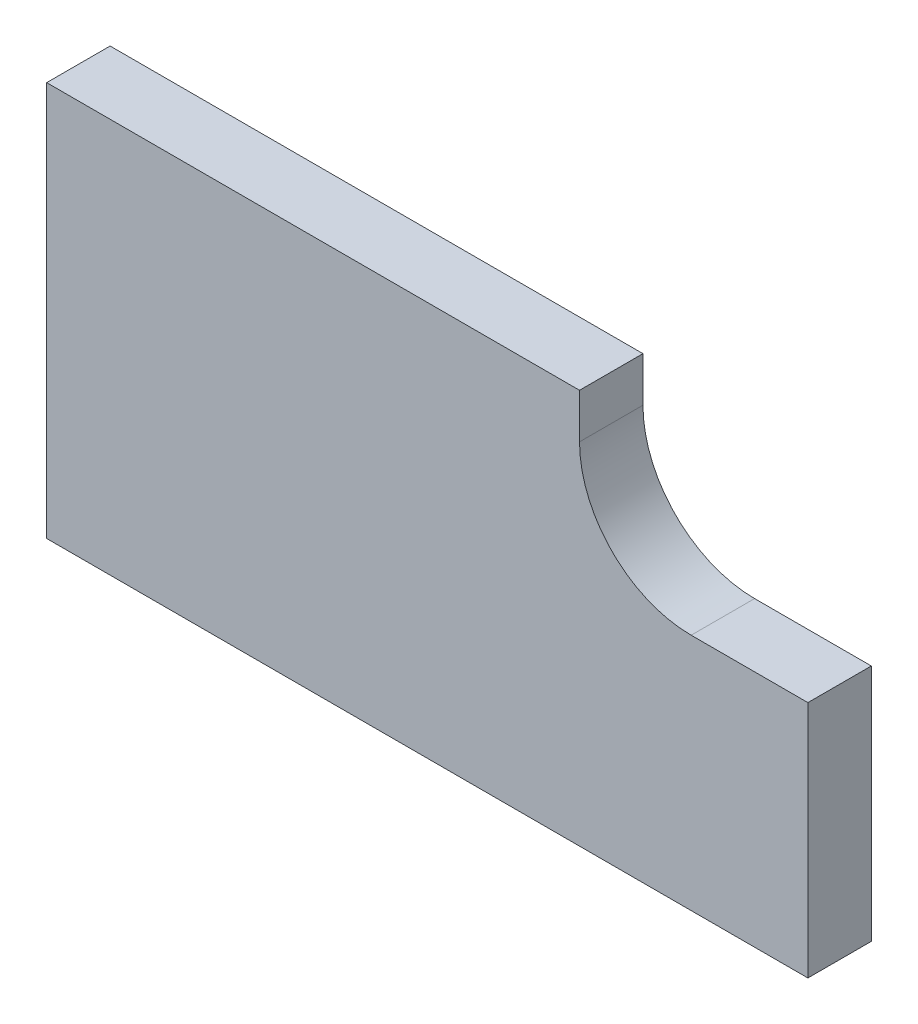
ISO-10303-21;
HEADER;
FILE_DESCRIPTION(('STEP AP214'),'2;1');
FILE_NAME('part.step','',(''),(''),'','','');
FILE_SCHEMA(('AUTOMOTIVE_DESIGN { 1 0 10303 214 1 1 1 1 }'));
ENDSEC;
DATA;
#1=APPLICATION_CONTEXT('core data for automotive mechanical design processes');
#2=APPLICATION_PROTOCOL_DEFINITION('international standard','automotive_design',2000,#1);
#3=PRODUCT_CONTEXT('',#1,'mechanical');
#4=PRODUCT('Part','Part','',(#3));
#5=PRODUCT_RELATED_PRODUCT_CATEGORY('part','',(#4));
#6=PRODUCT_DEFINITION_FORMATION('','',#4);
#7=PRODUCT_DEFINITION_CONTEXT('part definition',#1,'design');
#8=PRODUCT_DEFINITION('design','',#6,#7);
#9=PRODUCT_DEFINITION_SHAPE('','',#8);
#10=(LENGTH_UNIT() NAMED_UNIT(*) SI_UNIT(.MILLI.,.METRE.));
#11=(NAMED_UNIT(*) PLANE_ANGLE_UNIT() SI_UNIT($,.RADIAN.));
#12=(NAMED_UNIT(*) SI_UNIT($,.STERADIAN.) SOLID_ANGLE_UNIT());
#13=UNCERTAINTY_MEASURE_WITH_UNIT(LENGTH_MEASURE(1.E-05),#10,'distance_accuracy_value','');
#14=(GEOMETRIC_REPRESENTATION_CONTEXT(3) GLOBAL_UNCERTAINTY_ASSIGNED_CONTEXT((#13)) GLOBAL_UNIT_ASSIGNED_CONTEXT((#10,
#11,#12)) REPRESENTATION_CONTEXT('',''));
#15=CARTESIAN_POINT('',(0.,0.,0.));
#16=DIRECTION('',(0.,0.,1.));
#17=DIRECTION('',(1.,0.,0.));
#18=AXIS2_PLACEMENT_3D('',#15,#16,#17);
#19=CARTESIAN_POINT('',(0.,0.,5.5));
#20=DIRECTION('',(1.,0.,0.));
#21=DIRECTION('',(0.,0.,-1.));
#22=AXIS2_PLACEMENT_3D('',#19,#20,#21);
#23=PLANE('',#22);
#24=DIRECTION('',(0.,-1.,0.));
#25=VECTOR('',#24,1.);
#26=CARTESIAN_POINT('',(0.,92.,12.5));
#27=LINE('',#26,#25);
#28=CARTESIAN_POINT('',(0.,77.8,12.5));
#29=VERTEX_POINT('',#28);
#30=CARTESIAN_POINT('',(0.,0.,12.5));
#31=VERTEX_POINT('',#30);
#32=EDGE_CURVE('E113',#29,#31,#27,.T.);
#33=ORIENTED_EDGE('',*,*,#32,.F.);
#34=DIRECTION('',(0.,0.,1.));
#35=VECTOR('',#34,1.);
#36=CARTESIAN_POINT('',(0.,77.8,0.));
#37=LINE('',#36,#35);
#38=CARTESIAN_POINT('',(0.,77.8,0.));
#39=VERTEX_POINT('',#38);
#40=EDGE_CURVE('E55',#39,#29,#37,.T.);
#41=ORIENTED_EDGE('',*,*,#40,.F.);
#42=DIRECTION('',(0.,-1.,0.));
#43=VECTOR('',#42,1.);
#44=CARTESIAN_POINT('',(0.,0.,0.));
#45=LINE('',#44,#43);
#46=CARTESIAN_POINT('',(0.,0.,0.));
#47=VERTEX_POINT('',#46);
#48=EDGE_CURVE('E112',#39,#47,#45,.T.);
#49=ORIENTED_EDGE('',*,*,#48,.T.);
#50=DIRECTION('',(0.,0.,-1.));
#51=VECTOR('',#50,1.);
#52=CARTESIAN_POINT('',(0.,0.,5.5));
#53=LINE('',#52,#51);
#54=EDGE_CURVE('E11',#31,#47,#53,.T.);
#55=ORIENTED_EDGE('',*,*,#54,.F.);
#56=EDGE_LOOP('',(#33,#41,#49,#55));
#57=FACE_BOUND('',#56,.T.);
#58=ADVANCED_FACE('F40',(#57),#23,.F.);
#59=CARTESIAN_POINT('',(150.,0.,5.5));
#60=DIRECTION('',(0.,1.,0.));
#61=DIRECTION('',(0.,0.,1.));
#62=AXIS2_PLACEMENT_3D('',#59,#60,#61);
#63=PLANE('',#62);
#64=DIRECTION('',(1.,0.,0.));
#65=VECTOR('',#64,1.);
#66=CARTESIAN_POINT('',(150.,0.,0.));
#67=LINE('',#66,#65);
#68=CARTESIAN_POINT('',(150.,0.,0.));
#69=VERTEX_POINT('',#68);
#70=EDGE_CURVE('E119',#47,#69,#67,.T.);
#71=ORIENTED_EDGE('',*,*,#70,.T.);
#72=DIRECTION('',(0.,0.,-1.));
#73=VECTOR('',#72,1.);
#74=CARTESIAN_POINT('',(150.,0.,5.5));
#75=LINE('',#74,#73);
#76=CARTESIAN_POINT('',(150.,0.,12.5));
#77=VERTEX_POINT('',#76);
#78=EDGE_CURVE('E48',#77,#69,#75,.T.);
#79=ORIENTED_EDGE('',*,*,#78,.F.);
#80=DIRECTION('',(1.,0.,0.));
#81=VECTOR('',#80,1.);
#82=CARTESIAN_POINT('',(0.,0.,12.5));
#83=LINE('',#82,#81);
#84=EDGE_CURVE('E178',#31,#77,#83,.T.);
#85=ORIENTED_EDGE('',*,*,#84,.F.);
#86=ORIENTED_EDGE('',*,*,#54,.T.);
#87=EDGE_LOOP('',(#71,#79,#85,#86));
#88=FACE_BOUND('',#87,.T.);
#89=ADVANCED_FACE('F199',(#88),#63,.F.);
#90=CARTESIAN_POINT('',(150.,47.,5.5));
#91=DIRECTION('',(-1.,0.,0.));
#92=DIRECTION('',(0.,-1.,0.));
#93=AXIS2_PLACEMENT_3D('',#90,#91,#92);
#94=PLANE('',#93);
#95=DIRECTION('',(0.,1.,0.));
#96=VECTOR('',#95,1.);
#97=CARTESIAN_POINT('',(150.,47.,0.));
#98=LINE('',#97,#96);
#99=CARTESIAN_POINT('',(150.,47.,0.));
#100=VERTEX_POINT('',#99);
#101=EDGE_CURVE('E125',#69,#100,#98,.T.);
#102=ORIENTED_EDGE('',*,*,#101,.T.);
#103=DIRECTION('',(0.,0.,-1.));
#104=VECTOR('',#103,1.);
#105=CARTESIAN_POINT('',(150.,47.,5.5));
#106=LINE('',#105,#104);
#107=CARTESIAN_POINT('',(150.,47.,12.5));
#108=VERTEX_POINT('',#107);
#109=EDGE_CURVE('E148',#108,#100,#106,.T.);
#110=ORIENTED_EDGE('',*,*,#109,.F.);
#111=DIRECTION('',(0.,1.,0.));
#112=VECTOR('',#111,1.);
#113=CARTESIAN_POINT('',(150.,0.,12.5));
#114=LINE('',#113,#112);
#115=EDGE_CURVE('E157',#77,#108,#114,.T.);
#116=ORIENTED_EDGE('',*,*,#115,.F.);
#117=ORIENTED_EDGE('',*,*,#78,.T.);
#118=EDGE_LOOP('',(#102,#110,#116,#117));
#119=FACE_BOUND('',#118,.T.);
#120=ADVANCED_FACE('F155',(#119),#94,.F.);
#121=CARTESIAN_POINT('',(127.,47.,5.5));
#122=DIRECTION('',(0.,-1.,0.));
#123=DIRECTION('',(0.,0.,-1.));
#124=AXIS2_PLACEMENT_3D('',#121,#122,#123);
#125=PLANE('',#124);
#126=DIRECTION('',(-1.,0.,0.));
#127=VECTOR('',#126,1.);
#128=CARTESIAN_POINT('',(127.,47.,0.));
#129=LINE('',#128,#127);
#130=CARTESIAN_POINT('',(127.,47.,0.));
#131=VERTEX_POINT('',#130);
#132=EDGE_CURVE('E134',#100,#131,#129,.T.);
#133=ORIENTED_EDGE('',*,*,#132,.T.);
#134=DIRECTION('',(0.,0.,-1.));
#135=VECTOR('',#134,1.);
#136=CARTESIAN_POINT('',(127.,47.,5.5));
#137=LINE('',#136,#135);
#138=CARTESIAN_POINT('',(127.,47.,12.5));
#139=VERTEX_POINT('',#138);
#140=EDGE_CURVE('E145',#139,#131,#137,.T.);
#141=ORIENTED_EDGE('',*,*,#140,.F.);
#142=DIRECTION('',(-1.,0.,0.));
#143=VECTOR('',#142,1.);
#144=CARTESIAN_POINT('',(150.,47.,12.5));
#145=LINE('',#144,#143);
#146=EDGE_CURVE('E172',#108,#139,#145,.T.);
#147=ORIENTED_EDGE('',*,*,#146,.F.);
#148=ORIENTED_EDGE('',*,*,#109,.T.);
#149=EDGE_LOOP('',(#133,#141,#147,#148));
#150=FACE_BOUND('',#149,.T.);
#151=ADVANCED_FACE('F163',(#150),#125,.F.);
#152=CARTESIAN_POINT('',(127.,69.,5.5));
#153=DIRECTION('',(0.,0.,-1.));
#154=DIRECTION('',(-1.,0.,0.));
#155=AXIS2_PLACEMENT_3D('',#152,#153,#154);
#156=CYLINDRICAL_SURFACE('',#155,22.);
#157=CARTESIAN_POINT('',(127.,69.,0.));
#158=DIRECTION('',(0.,0.,-1.));
#159=DIRECTION('',(1.,0.,0.));
#160=AXIS2_PLACEMENT_3D('',#157,#158,#159);
#161=CIRCLE('',#160,22.);
#162=CARTESIAN_POINT('',(105.,69.,0.));
#163=VERTEX_POINT('',#162);
#164=EDGE_CURVE('E63',#131,#163,#161,.T.);
#165=ORIENTED_EDGE('',*,*,#164,.T.);
#166=DIRECTION('',(0.,0.,-1.));
#167=VECTOR('',#166,1.);
#168=CARTESIAN_POINT('',(105.,69.,5.5));
#169=LINE('',#168,#167);
#170=CARTESIAN_POINT('',(105.,69.,12.5));
#171=VERTEX_POINT('',#170);
#172=EDGE_CURVE('E142',#171,#163,#169,.T.);
#173=ORIENTED_EDGE('',*,*,#172,.F.);
#174=CARTESIAN_POINT('',(127.,69.,12.5));
#175=DIRECTION('',(0.,0.,-1.));
#176=DIRECTION('',(1.,0.,0.));
#177=AXIS2_PLACEMENT_3D('',#174,#175,#176);
#178=CIRCLE('',#177,22.);
#179=EDGE_CURVE('E128',#139,#171,#178,.T.);
#180=ORIENTED_EDGE('',*,*,#179,.F.);
#181=ORIENTED_EDGE('',*,*,#140,.T.);
#182=EDGE_LOOP('',(#165,#173,#180,#181));
#183=FACE_BOUND('',#182,.T.);
#184=ADVANCED_FACE('F167',(#183),#156,.F.);
#185=CARTESIAN_POINT('',(105.,92.,5.5));
#186=DIRECTION('',(-1.,0.,0.));
#187=DIRECTION('',(0.,-1.,0.));
#188=AXIS2_PLACEMENT_3D('',#185,#186,#187);
#189=PLANE('',#188);
#190=DIRECTION('',(0.,1.,0.));
#191=VECTOR('',#190,1.);
#192=CARTESIAN_POINT('',(105.,92.,0.));
#193=LINE('',#192,#191);
#194=CARTESIAN_POINT('',(105.,77.8,0.));
#195=VERTEX_POINT('',#194);
#196=EDGE_CURVE('E139',#163,#195,#193,.T.);
#197=ORIENTED_EDGE('',*,*,#196,.T.);
#198=DIRECTION('',(0.,0.,1.));
#199=VECTOR('',#198,1.);
#200=CARTESIAN_POINT('',(105.,77.8,0.));
#201=LINE('',#200,#199);
#202=CARTESIAN_POINT('',(105.,77.8,12.5));
#203=VERTEX_POINT('',#202);
#204=EDGE_CURVE('E101',#195,#203,#201,.T.);
#205=ORIENTED_EDGE('',*,*,#204,.T.);
#206=DIRECTION('',(0.,1.,0.));
#207=VECTOR('',#206,1.);
#208=CARTESIAN_POINT('',(105.,69.,12.5));
#209=LINE('',#208,#207);
#210=EDGE_CURVE('E121',#171,#203,#209,.T.);
#211=ORIENTED_EDGE('',*,*,#210,.F.);
#212=ORIENTED_EDGE('',*,*,#172,.T.);
#213=EDGE_LOOP('',(#197,#205,#211,#212));
#214=FACE_BOUND('',#213,.T.);
#215=ADVANCED_FACE('F187',(#214),#189,.F.);
#216=CARTESIAN_POINT('',(127.,69.,0.));
#217=DIRECTION('',(0.,0.,1.));
#218=DIRECTION('',(1.,0.,0.));
#219=AXIS2_PLACEMENT_3D('',#216,#217,#218);
#220=PLANE('',#219);
#221=ORIENTED_EDGE('',*,*,#48,.F.);
#222=DIRECTION('',(1.,0.,0.));
#223=VECTOR('',#222,1.);
#224=CARTESIAN_POINT('',(0.,77.8,0.));
#225=LINE('',#224,#223);
#226=EDGE_CURVE('E98',#39,#195,#225,.T.);
#227=ORIENTED_EDGE('',*,*,#226,.T.);
#228=ORIENTED_EDGE('',*,*,#196,.F.);
#229=ORIENTED_EDGE('',*,*,#164,.F.);
#230=ORIENTED_EDGE('',*,*,#132,.F.);
#231=ORIENTED_EDGE('',*,*,#101,.F.);
#232=ORIENTED_EDGE('',*,*,#70,.F.);
#233=EDGE_LOOP('',(#221,#227,#228,#229,#230,#231,#232));
#234=FACE_BOUND('',#233,.T.);
#235=ADVANCED_FACE('F117',(#234),#220,.F.);
#236=CARTESIAN_POINT('',(127.,69.,12.5));
#237=DIRECTION('',(0.,0.,1.));
#238=DIRECTION('',(1.,0.,0.));
#239=AXIS2_PLACEMENT_3D('',#236,#237,#238);
#240=PLANE('',#239);
#241=DIRECTION('',(1.,0.,0.));
#242=VECTOR('',#241,1.);
#243=CARTESIAN_POINT('',(0.,77.8,12.5));
#244=LINE('',#243,#242);
#245=EDGE_CURVE('E107',#29,#203,#244,.T.);
#246=ORIENTED_EDGE('',*,*,#245,.F.);
#247=ORIENTED_EDGE('',*,*,#32,.T.);
#248=ORIENTED_EDGE('',*,*,#84,.T.);
#249=ORIENTED_EDGE('',*,*,#115,.T.);
#250=ORIENTED_EDGE('',*,*,#146,.T.);
#251=ORIENTED_EDGE('',*,*,#179,.T.);
#252=ORIENTED_EDGE('',*,*,#210,.T.);
#253=EDGE_LOOP('',(#246,#247,#248,#249,#250,#251,#252));
#254=FACE_BOUND('',#253,.T.);
#255=ADVANCED_FACE('F188',(#254),#240,.T.);
#256=CARTESIAN_POINT('',(0.,77.8,0.));
#257=DIRECTION('',(0.,-1.,0.));
#258=DIRECTION('',(0.,0.,-1.));
#259=AXIS2_PLACEMENT_3D('',#256,#257,#258);
#260=PLANE('',#259);
#261=ORIENTED_EDGE('',*,*,#245,.T.);
#262=ORIENTED_EDGE('',*,*,#204,.F.);
#263=ORIENTED_EDGE('',*,*,#226,.F.);
#264=ORIENTED_EDGE('',*,*,#40,.T.);
#265=EDGE_LOOP('',(#261,#262,#263,#264));
#266=FACE_BOUND('',#265,.T.);
#267=ADVANCED_FACE('F99',(#266),#260,.F.);
#268=CLOSED_SHELL('',(#58,#89,#120,#151,#184,#215,#235,#255,#267));
#269=MANIFOLD_SOLID_BREP('B2',#268);
#270=ADVANCED_BREP_SHAPE_REPRESENTATION('',(#18,#269),#14);
#271=SHAPE_DEFINITION_REPRESENTATION(#9,#270);
ENDSEC;
END-ISO-10303-21;
